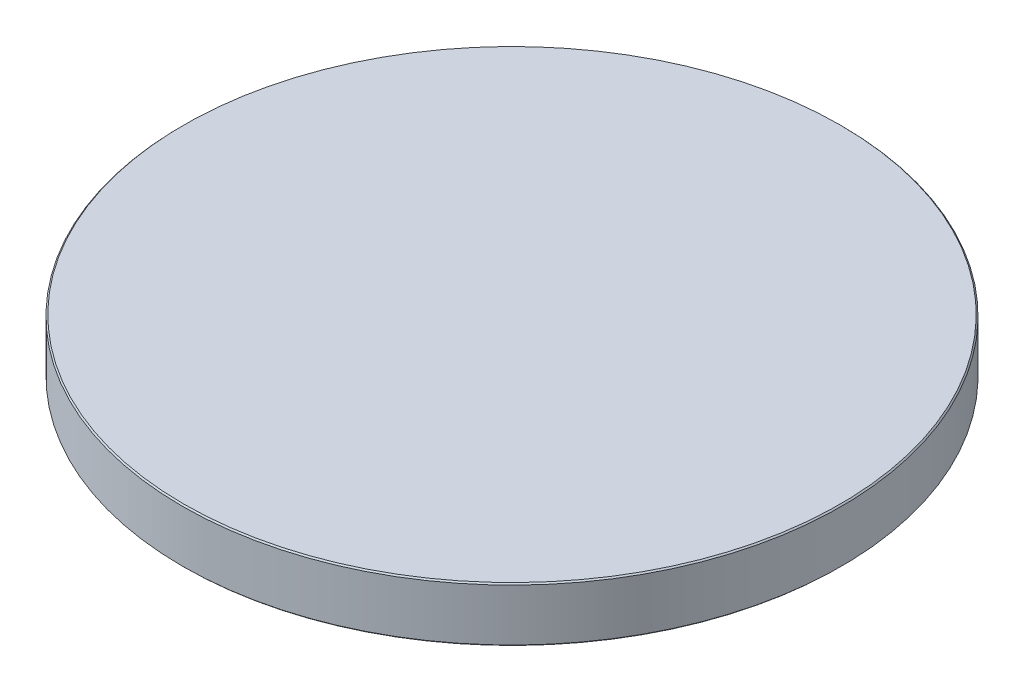
ISO-10303-21;
HEADER;
FILE_DESCRIPTION(('STEP AP214'),'2;1');
FILE_NAME('part.step','',(''),(''),'','','');
FILE_SCHEMA(('AUTOMOTIVE_DESIGN { 1 0 10303 214 1 1 1 1 }'));
ENDSEC;
DATA;
#1=APPLICATION_CONTEXT('core data for automotive mechanical design processes');
#2=APPLICATION_PROTOCOL_DEFINITION('international standard','automotive_design',2000,#1);
#3=PRODUCT_CONTEXT('',#1,'mechanical');
#4=PRODUCT('Part','Part','',(#3));
#5=PRODUCT_RELATED_PRODUCT_CATEGORY('part','',(#4));
#6=PRODUCT_DEFINITION_FORMATION('','',#4);
#7=PRODUCT_DEFINITION_CONTEXT('part definition',#1,'design');
#8=PRODUCT_DEFINITION('design','',#6,#7);
#9=PRODUCT_DEFINITION_SHAPE('','',#8);
#10=(LENGTH_UNIT() NAMED_UNIT(*) SI_UNIT(.MILLI.,.METRE.));
#11=(NAMED_UNIT(*) PLANE_ANGLE_UNIT() SI_UNIT($,.RADIAN.));
#12=(NAMED_UNIT(*) SI_UNIT($,.STERADIAN.) SOLID_ANGLE_UNIT());
#13=UNCERTAINTY_MEASURE_WITH_UNIT(LENGTH_MEASURE(1.E-05),#10,'distance_accuracy_value','');
#14=(GEOMETRIC_REPRESENTATION_CONTEXT(3) GLOBAL_UNCERTAINTY_ASSIGNED_CONTEXT((#13)) GLOBAL_UNIT_ASSIGNED_CONTEXT((#10,
#11,#12)) REPRESENTATION_CONTEXT('',''));
#15=CARTESIAN_POINT('',(0.,0.,0.));
#16=DIRECTION('',(0.,0.,1.));
#17=DIRECTION('',(1.,0.,0.));
#18=AXIS2_PLACEMENT_3D('',#15,#16,#17);
#19=CARTESIAN_POINT('',(0.,2.1,0.));
#20=DIRECTION('',(0.,-1.,0.));
#21=DIRECTION('',(0.,0.,-1.));
#22=AXIS2_PLACEMENT_3D('',#19,#20,#21);
#23=CYLINDRICAL_SURFACE('',#22,12.7);
#24=CARTESIAN_POINT('',(0.,2.05,0.));
#25=DIRECTION('',(0.,1.,0.));
#26=DIRECTION('',(0.,0.,1.));
#27=AXIS2_PLACEMENT_3D('',#24,#25,#26);
#28=CIRCLE('',#27,12.7);
#29=CARTESIAN_POINT('',(0.,2.05,12.7));
#30=VERTEX_POINT('',#29);
#31=EDGE_CURVE('E37',#30,#30,#28,.F.);
#32=ORIENTED_EDGE('',*,*,#31,.T.);
#33=EDGE_LOOP('',(#32));
#34=FACE_BOUND('',#33,.T.);
#35=CARTESIAN_POINT('',(0.,0.0499999999999962,0.));
#36=DIRECTION('',(0.,1.,0.));
#37=DIRECTION('',(0.,0.,1.));
#38=AXIS2_PLACEMENT_3D('',#35,#36,#37);
#39=CIRCLE('',#38,12.7);
#40=CARTESIAN_POINT('',(0.,0.0499999999999962,12.7));
#41=VERTEX_POINT('',#40);
#42=EDGE_CURVE('E41',#41,#41,#39,.T.);
#43=ORIENTED_EDGE('',*,*,#42,.T.);
#44=EDGE_LOOP('',(#43));
#45=FACE_BOUND('',#44,.T.);
#46=ADVANCED_FACE('F30',(#34,#45),#23,.T.);
#47=CARTESIAN_POINT('',(0.,2.1,0.));
#48=DIRECTION('',(0.,1.,0.));
#49=DIRECTION('',(0.,0.,1.));
#50=AXIS2_PLACEMENT_3D('',#47,#48,#49);
#51=PLANE('',#50);
#52=CARTESIAN_POINT('',(0.,2.1,0.));
#53=DIRECTION('',(0.,1.,0.));
#54=DIRECTION('',(0.,0.,1.));
#55=AXIS2_PLACEMENT_3D('',#52,#53,#54);
#56=CIRCLE('',#55,12.65);
#57=CARTESIAN_POINT('',(0.,2.1,12.65));
#58=VERTEX_POINT('',#57);
#59=EDGE_CURVE('E45',#58,#58,#56,.T.);
#60=ORIENTED_EDGE('',*,*,#59,.T.);
#61=EDGE_LOOP('',(#60));
#62=FACE_BOUND('',#61,.T.);
#63=ADVANCED_FACE('F51',(#62),#51,.T.);
#64=CARTESIAN_POINT('',(0.,0.,0.));
#65=DIRECTION('',(0.,1.,0.));
#66=DIRECTION('',(0.,0.,1.));
#67=AXIS2_PLACEMENT_3D('',#64,#65,#66);
#68=PLANE('',#67);
#69=CARTESIAN_POINT('',(0.,0.,0.));
#70=DIRECTION('',(0.,1.,0.));
#71=DIRECTION('',(0.,0.,1.));
#72=AXIS2_PLACEMENT_3D('',#69,#70,#71);
#73=CIRCLE('',#72,12.65);
#74=CARTESIAN_POINT('',(0.,0.,12.65));
#75=VERTEX_POINT('',#74);
#76=EDGE_CURVE('E10',#75,#75,#73,.F.);
#77=ORIENTED_EDGE('',*,*,#76,.T.);
#78=EDGE_LOOP('',(#77));
#79=FACE_BOUND('',#78,.T.);
#80=ADVANCED_FACE('F55',(#79),#68,.F.);
#81=CARTESIAN_POINT('',(0.,2.1,0.));
#82=DIRECTION('',(0.,-1.,0.));
#83=DIRECTION('',(0.,0.,-1.));
#84=AXIS2_PLACEMENT_3D('',#81,#82,#83);
#85=CONICAL_SURFACE('',#84,12.65,0.785398163397466);
#86=ORIENTED_EDGE('',*,*,#31,.F.);
#87=EDGE_LOOP('',(#86));
#88=FACE_BOUND('',#87,.T.);
#89=ORIENTED_EDGE('',*,*,#59,.F.);
#90=EDGE_LOOP('',(#89));
#91=FACE_BOUND('',#90,.T.);
#92=ADVANCED_FACE('F53',(#88,#91),#85,.T.);
#93=CARTESIAN_POINT('',(0.,0.0499999999999962,0.));
#94=DIRECTION('',(0.,1.,0.));
#95=DIRECTION('',(0.,0.,1.));
#96=AXIS2_PLACEMENT_3D('',#93,#94,#95);
#97=CONICAL_SURFACE('',#96,12.7,0.785398163397466);
#98=ORIENTED_EDGE('',*,*,#76,.F.);
#99=EDGE_LOOP('',(#98));
#100=FACE_BOUND('',#99,.T.);
#101=ORIENTED_EDGE('',*,*,#42,.F.);
#102=EDGE_LOOP('',(#101));
#103=FACE_BOUND('',#102,.T.);
#104=ADVANCED_FACE('F32',(#100,#103),#97,.T.);
#105=CLOSED_SHELL('',(#46,#63,#80,#92,#104));
#106=MANIFOLD_SOLID_BREP('B2',#105);
#107=ADVANCED_BREP_SHAPE_REPRESENTATION('',(#18,#106),#14);
#108=SHAPE_DEFINITION_REPRESENTATION(#9,#107);
ENDSEC;
END-ISO-10303-21;
